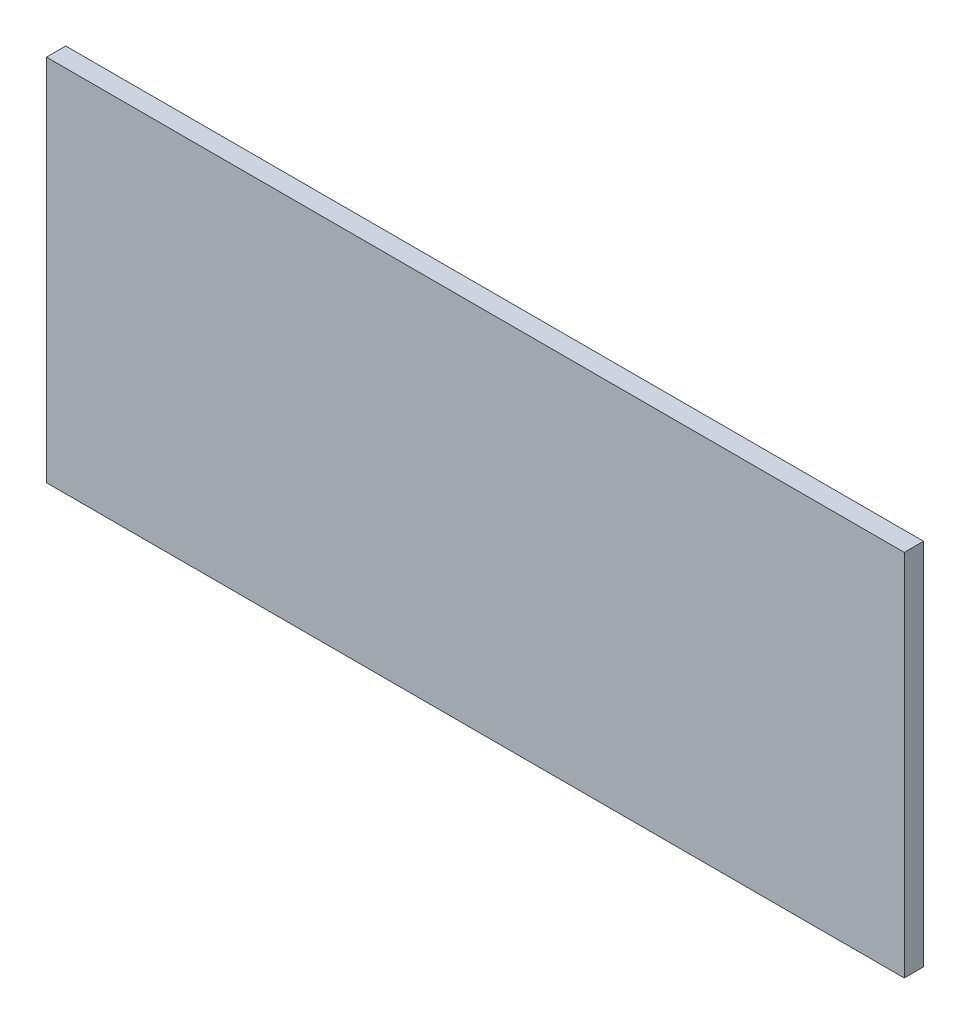
ISO-10303-21;
HEADER;
FILE_DESCRIPTION(('STEP AP214'),'2;1');
FILE_NAME('part.step','',(''),(''),'','','');
FILE_SCHEMA(('AUTOMOTIVE_DESIGN { 1 0 10303 214 1 1 1 1 }'));
ENDSEC;
DATA;
#1=APPLICATION_CONTEXT('core data for automotive mechanical design processes');
#2=APPLICATION_PROTOCOL_DEFINITION('international standard','automotive_design',2000,#1);
#3=PRODUCT_CONTEXT('',#1,'mechanical');
#4=PRODUCT('Part','Part','',(#3));
#5=PRODUCT_RELATED_PRODUCT_CATEGORY('part','',(#4));
#6=PRODUCT_DEFINITION_FORMATION('','',#4);
#7=PRODUCT_DEFINITION_CONTEXT('part definition',#1,'design');
#8=PRODUCT_DEFINITION('design','',#6,#7);
#9=PRODUCT_DEFINITION_SHAPE('','',#8);
#10=(LENGTH_UNIT() NAMED_UNIT(*) SI_UNIT(.MILLI.,.METRE.));
#11=(NAMED_UNIT(*) PLANE_ANGLE_UNIT() SI_UNIT($,.RADIAN.));
#12=(NAMED_UNIT(*) SI_UNIT($,.STERADIAN.) SOLID_ANGLE_UNIT());
#13=UNCERTAINTY_MEASURE_WITH_UNIT(LENGTH_MEASURE(1.E-05),#10,'distance_accuracy_value','');
#14=(GEOMETRIC_REPRESENTATION_CONTEXT(3) GLOBAL_UNCERTAINTY_ASSIGNED_CONTEXT((#13)) GLOBAL_UNIT_ASSIGNED_CONTEXT((#10,
#11,#12)) REPRESENTATION_CONTEXT('',''));
#15=CARTESIAN_POINT('',(0.,0.,0.));
#16=DIRECTION('',(0.,0.,1.));
#17=DIRECTION('',(1.,0.,0.));
#18=AXIS2_PLACEMENT_3D('',#15,#16,#17);
#19=CARTESIAN_POINT('',(-35.052,-15.0622,1.5748));
#20=DIRECTION('',(1.,0.,0.));
#21=DIRECTION('',(0.,0.,-1.));
#22=AXIS2_PLACEMENT_3D('',#19,#20,#21);
#23=PLANE('',#22);
#24=DIRECTION('',(0.,-1.,0.));
#25=VECTOR('',#24,1.);
#26=CARTESIAN_POINT('',(-35.052,-15.0622,0.));
#27=LINE('',#26,#25);
#28=CARTESIAN_POINT('',(-35.052,15.0622,0.));
#29=VERTEX_POINT('',#28);
#30=CARTESIAN_POINT('',(-35.052,-15.0622,0.));
#31=VERTEX_POINT('',#30);
#32=EDGE_CURVE('E97',#29,#31,#27,.T.);
#33=ORIENTED_EDGE('',*,*,#32,.T.);
#34=DIRECTION('',(0.,0.,-1.));
#35=VECTOR('',#34,1.);
#36=CARTESIAN_POINT('',(-35.052,-15.0622,1.5748));
#37=LINE('',#36,#35);
#38=CARTESIAN_POINT('',(-35.052,-15.0622,1.5748));
#39=VERTEX_POINT('',#38);
#40=EDGE_CURVE('E11',#39,#31,#37,.T.);
#41=ORIENTED_EDGE('',*,*,#40,.F.);
#42=DIRECTION('',(0.,-1.,0.));
#43=VECTOR('',#42,1.);
#44=CARTESIAN_POINT('',(-35.052,-15.0622,1.5748));
#45=LINE('',#44,#43);
#46=CARTESIAN_POINT('',(-35.052,15.0622,1.5748));
#47=VERTEX_POINT('',#46);
#48=EDGE_CURVE('E85',#47,#39,#45,.T.);
#49=ORIENTED_EDGE('',*,*,#48,.F.);
#50=DIRECTION('',(0.,0.,-1.));
#51=VECTOR('',#50,1.);
#52=CARTESIAN_POINT('',(-35.052,15.0622,1.5748));
#53=LINE('',#52,#51);
#54=EDGE_CURVE('E93',#47,#29,#53,.T.);
#55=ORIENTED_EDGE('',*,*,#54,.T.);
#56=EDGE_LOOP('',(#33,#41,#49,#55));
#57=FACE_BOUND('',#56,.T.);
#58=ADVANCED_FACE('F34',(#57),#23,.F.);
#59=CARTESIAN_POINT('',(35.052,-15.0622,1.5748));
#60=DIRECTION('',(0.,1.,0.));
#61=DIRECTION('',(-1.,0.,0.));
#62=AXIS2_PLACEMENT_3D('',#59,#60,#61);
#63=PLANE('',#62);
#64=DIRECTION('',(1.,0.,0.));
#65=VECTOR('',#64,1.);
#66=CARTESIAN_POINT('',(35.052,-15.0622,0.));
#67=LINE('',#66,#65);
#68=CARTESIAN_POINT('',(35.052,-15.0622,0.));
#69=VERTEX_POINT('',#68);
#70=EDGE_CURVE('E89',#31,#69,#67,.T.);
#71=ORIENTED_EDGE('',*,*,#70,.T.);
#72=DIRECTION('',(0.,0.,-1.));
#73=VECTOR('',#72,1.);
#74=CARTESIAN_POINT('',(35.052,-15.0622,1.5748));
#75=LINE('',#74,#73);
#76=CARTESIAN_POINT('',(35.052,-15.0622,1.5748));
#77=VERTEX_POINT('',#76);
#78=EDGE_CURVE('E42',#77,#69,#75,.T.);
#79=ORIENTED_EDGE('',*,*,#78,.F.);
#80=DIRECTION('',(1.,0.,0.));
#81=VECTOR('',#80,1.);
#82=CARTESIAN_POINT('',(35.052,-15.0622,1.5748));
#83=LINE('',#82,#81);
#84=EDGE_CURVE('E80',#39,#77,#83,.T.);
#85=ORIENTED_EDGE('',*,*,#84,.F.);
#86=ORIENTED_EDGE('',*,*,#40,.T.);
#87=EDGE_LOOP('',(#71,#79,#85,#86));
#88=FACE_BOUND('',#87,.T.);
#89=ADVANCED_FACE('F88',(#88),#63,.F.);
#90=CARTESIAN_POINT('',(35.052,-15.0622,1.5748));
#91=DIRECTION('',(-1.,0.,0.));
#92=DIRECTION('',(0.,0.,1.));
#93=AXIS2_PLACEMENT_3D('',#90,#91,#92);
#94=PLANE('',#93);
#95=DIRECTION('',(0.,1.,0.));
#96=VECTOR('',#95,1.);
#97=CARTESIAN_POINT('',(35.052,-15.0622,0.));
#98=LINE('',#97,#96);
#99=CARTESIAN_POINT('',(35.052,15.0622,0.));
#100=VERTEX_POINT('',#99);
#101=EDGE_CURVE('E67',#69,#100,#98,.T.);
#102=ORIENTED_EDGE('',*,*,#101,.T.);
#103=DIRECTION('',(0.,0.,-1.));
#104=VECTOR('',#103,1.);
#105=CARTESIAN_POINT('',(35.052,15.0622,1.5748));
#106=LINE('',#105,#104);
#107=CARTESIAN_POINT('',(35.052,15.0622,1.5748));
#108=VERTEX_POINT('',#107);
#109=EDGE_CURVE('E90',#108,#100,#106,.T.);
#110=ORIENTED_EDGE('',*,*,#109,.F.);
#111=DIRECTION('',(0.,1.,0.));
#112=VECTOR('',#111,1.);
#113=CARTESIAN_POINT('',(35.052,-15.0622,1.5748));
#114=LINE('',#113,#112);
#115=EDGE_CURVE('E83',#77,#108,#114,.T.);
#116=ORIENTED_EDGE('',*,*,#115,.F.);
#117=ORIENTED_EDGE('',*,*,#78,.T.);
#118=EDGE_LOOP('',(#102,#110,#116,#117));
#119=FACE_BOUND('',#118,.T.);
#120=ADVANCED_FACE('F91',(#119),#94,.F.);
#121=CARTESIAN_POINT('',(35.052,15.0622,1.5748));
#122=DIRECTION('',(0.,-1.,0.));
#123=DIRECTION('',(1.,0.,0.));
#124=AXIS2_PLACEMENT_3D('',#121,#122,#123);
#125=PLANE('',#124);
#126=DIRECTION('',(-1.,0.,0.));
#127=VECTOR('',#126,1.);
#128=CARTESIAN_POINT('',(35.052,15.0622,0.));
#129=LINE('',#128,#127);
#130=EDGE_CURVE('E73',#100,#29,#129,.T.);
#131=ORIENTED_EDGE('',*,*,#130,.T.);
#132=ORIENTED_EDGE('',*,*,#54,.F.);
#133=DIRECTION('',(-1.,0.,0.));
#134=VECTOR('',#133,1.);
#135=CARTESIAN_POINT('',(35.052,15.0622,1.5748));
#136=LINE('',#135,#134);
#137=EDGE_CURVE('E50',#108,#47,#136,.T.);
#138=ORIENTED_EDGE('',*,*,#137,.F.);
#139=ORIENTED_EDGE('',*,*,#109,.T.);
#140=EDGE_LOOP('',(#131,#132,#138,#139));
#141=FACE_BOUND('',#140,.T.);
#142=ADVANCED_FACE('F104',(#141),#125,.F.);
#143=CARTESIAN_POINT('',(0.,0.,1.5748));
#144=DIRECTION('',(0.,0.,1.));
#145=DIRECTION('',(1.,0.,0.));
#146=AXIS2_PLACEMENT_3D('',#143,#144,#145);
#147=PLANE('',#146);
#148=ORIENTED_EDGE('',*,*,#48,.T.);
#149=ORIENTED_EDGE('',*,*,#84,.T.);
#150=ORIENTED_EDGE('',*,*,#115,.T.);
#151=ORIENTED_EDGE('',*,*,#137,.T.);
#152=EDGE_LOOP('',(#148,#149,#150,#151));
#153=FACE_BOUND('',#152,.T.);
#154=ADVANCED_FACE('F81',(#153),#147,.T.);
#155=CARTESIAN_POINT('',(0.,0.,0.));
#156=DIRECTION('',(0.,0.,1.));
#157=DIRECTION('',(1.,0.,0.));
#158=AXIS2_PLACEMENT_3D('',#155,#156,#157);
#159=PLANE('',#158);
#160=ORIENTED_EDGE('',*,*,#32,.F.);
#161=ORIENTED_EDGE('',*,*,#130,.F.);
#162=ORIENTED_EDGE('',*,*,#101,.F.);
#163=ORIENTED_EDGE('',*,*,#70,.F.);
#164=EDGE_LOOP('',(#160,#161,#162,#163));
#165=FACE_BOUND('',#164,.T.);
#166=ADVANCED_FACE('F107',(#165),#159,.F.);
#167=CLOSED_SHELL('',(#58,#89,#120,#142,#154,#166));
#168=MANIFOLD_SOLID_BREP('B2',#167);
#169=ADVANCED_BREP_SHAPE_REPRESENTATION('',(#18,#168),#14);
#170=SHAPE_DEFINITION_REPRESENTATION(#9,#169);
ENDSEC;
END-ISO-10303-21;
